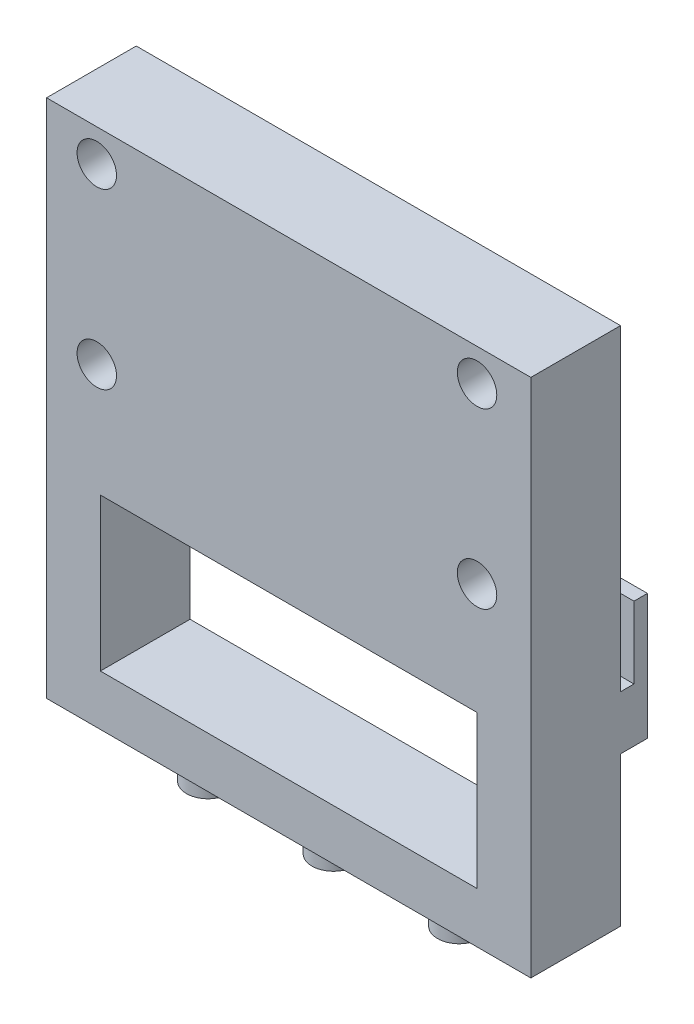
ISO-10303-21;
HEADER;
FILE_DESCRIPTION(('STEP AP214'),'2;1');
FILE_NAME('part.step','',(''),(''),'','','');
FILE_SCHEMA(('AUTOMOTIVE_DESIGN { 1 0 10303 214 1 1 1 1 }'));
ENDSEC;
DATA;
#1=APPLICATION_CONTEXT('core data for automotive mechanical design processes');
#2=APPLICATION_PROTOCOL_DEFINITION('international standard','automotive_design',2000,#1);
#3=PRODUCT_CONTEXT('',#1,'mechanical');
#4=PRODUCT('Part','Part','',(#3));
#5=PRODUCT_RELATED_PRODUCT_CATEGORY('part','',(#4));
#6=PRODUCT_DEFINITION_FORMATION('','',#4);
#7=PRODUCT_DEFINITION_CONTEXT('part definition',#1,'design');
#8=PRODUCT_DEFINITION('design','',#6,#7);
#9=PRODUCT_DEFINITION_SHAPE('','',#8);
#10=(LENGTH_UNIT() NAMED_UNIT(*) SI_UNIT(.MILLI.,.METRE.));
#11=(NAMED_UNIT(*) PLANE_ANGLE_UNIT() SI_UNIT($,.RADIAN.));
#12=(NAMED_UNIT(*) SI_UNIT($,.STERADIAN.) SOLID_ANGLE_UNIT());
#13=UNCERTAINTY_MEASURE_WITH_UNIT(LENGTH_MEASURE(1.E-05),#10,'distance_accuracy_value','');
#14=(GEOMETRIC_REPRESENTATION_CONTEXT(3) GLOBAL_UNCERTAINTY_ASSIGNED_CONTEXT((#13)) GLOBAL_UNIT_ASSIGNED_CONTEXT((#10,
#11,#12)) REPRESENTATION_CONTEXT('',''));
#15=CARTESIAN_POINT('',(0.,0.,0.));
#16=DIRECTION('',(0.,0.,1.));
#17=DIRECTION('',(1.,0.,0.));
#18=AXIS2_PLACEMENT_3D('',#15,#16,#17);
#19=CARTESIAN_POINT('',(-10.5,-3.17907805529329,-1.5));
#20=DIRECTION('',(0.,-1.,0.));
#21=DIRECTION('',(1.,0.,0.));
#22=AXIS2_PLACEMENT_3D('',#19,#20,#21);
#23=PLANE('',#22);
#24=DIRECTION('',(1.,0.,0.));
#25=VECTOR('',#24,1.);
#26=CARTESIAN_POINT('',(-13.5,-3.17907805529329,-0.75));
#27=LINE('',#26,#25);
#28=CARTESIAN_POINT('',(-13.5,-3.17907805529329,-0.75));
#29=VERTEX_POINT('',#28);
#30=CARTESIAN_POINT('',(-10.5,-3.17907805529329,-0.75));
#31=VERTEX_POINT('',#30);
#32=EDGE_CURVE('E443',#29,#31,#27,.T.);
#33=ORIENTED_EDGE('',*,*,#32,.F.);
#34=DIRECTION('',(0.,0.,1.));
#35=VECTOR('',#34,1.);
#36=CARTESIAN_POINT('',(-13.5,-3.17907805529329,-1.5));
#37=LINE('',#36,#35);
#38=CARTESIAN_POINT('',(-13.5,-3.17907805529329,0.));
#39=VERTEX_POINT('',#38);
#40=EDGE_CURVE('E71',#29,#39,#37,.T.);
#41=ORIENTED_EDGE('',*,*,#40,.T.);
#42=DIRECTION('',(1.,0.,0.));
#43=VECTOR('',#42,1.);
#44=CARTESIAN_POINT('',(-10.5,-3.17907805529329,0.));
#45=LINE('',#44,#43);
#46=CARTESIAN_POINT('',(-10.5,-3.17907805529329,0.));
#47=VERTEX_POINT('',#46);
#48=EDGE_CURVE('E256',#39,#47,#45,.T.);
#49=ORIENTED_EDGE('',*,*,#48,.T.);
#50=DIRECTION('',(0.,0.,1.));
#51=VECTOR('',#50,1.);
#52=CARTESIAN_POINT('',(-10.5,-3.17907805529329,-1.5));
#53=LINE('',#52,#51);
#54=EDGE_CURVE('E246',#31,#47,#53,.T.);
#55=ORIENTED_EDGE('',*,*,#54,.F.);
#56=EDGE_LOOP('',(#33,#41,#49,#55));
#57=FACE_BOUND('',#56,.T.);
#58=ADVANCED_FACE('F47',(#57),#23,.F.);
#59=CARTESIAN_POINT('',(13.5,-3.17907805529329,-1.5));
#60=DIRECTION('',(0.,-1.,0.));
#61=DIRECTION('',(0.,0.,-1.));
#62=AXIS2_PLACEMENT_3D('',#59,#60,#61);
#63=PLANE('',#62);
#64=CARTESIAN_POINT('',(10.5,-3.17907805529329,-0.75));
#65=VERTEX_POINT('',#64);
#66=CARTESIAN_POINT('',(13.5,-3.17907805529329,-0.75));
#67=VERTEX_POINT('',#66);
#68=EDGE_CURVE('E446',#65,#67,#27,.T.);
#69=ORIENTED_EDGE('',*,*,#68,.F.);
#70=DIRECTION('',(0.,0.,1.));
#71=VECTOR('',#70,1.);
#72=CARTESIAN_POINT('',(10.5,-3.17907805529329,-1.5));
#73=LINE('',#72,#71);
#74=CARTESIAN_POINT('',(10.5,-3.17907805529329,0.));
#75=VERTEX_POINT('',#74);
#76=EDGE_CURVE('E220',#65,#75,#73,.T.);
#77=ORIENTED_EDGE('',*,*,#76,.T.);
#78=DIRECTION('',(1.,0.,0.));
#79=VECTOR('',#78,1.);
#80=CARTESIAN_POINT('',(13.5,-3.17907805529329,0.));
#81=LINE('',#80,#79);
#82=CARTESIAN_POINT('',(13.5,-3.17907805529329,0.));
#83=VERTEX_POINT('',#82);
#84=EDGE_CURVE('E221',#75,#83,#81,.T.);
#85=ORIENTED_EDGE('',*,*,#84,.T.);
#86=DIRECTION('',(0.,0.,1.));
#87=VECTOR('',#86,1.);
#88=CARTESIAN_POINT('',(13.5,-3.17907805529329,-1.5));
#89=LINE('',#88,#87);
#90=EDGE_CURVE('E240',#67,#83,#89,.T.);
#91=ORIENTED_EDGE('',*,*,#90,.F.);
#92=EDGE_LOOP('',(#69,#77,#85,#91));
#93=FACE_BOUND('',#92,.T.);
#94=ADVANCED_FACE('F455',(#93),#63,.F.);
#95=CARTESIAN_POINT('',(0.,0.,0.));
#96=DIRECTION('',(0.,0.,1.));
#97=DIRECTION('',(1.,0.,0.));
#98=AXIS2_PLACEMENT_3D('',#95,#96,#97);
#99=PLANE('',#98);
#100=CARTESIAN_POINT('',(10.5,12.7,0.));
#101=DIRECTION('',(0.,0.,1.));
#102=DIRECTION('',(1.,0.,0.));
#103=AXIS2_PLACEMENT_3D('',#100,#101,#102);
#104=CIRCLE('',#103,1.1);
#105=CARTESIAN_POINT('',(11.6,12.7,0.));
#106=VERTEX_POINT('',#105);
#107=EDGE_CURVE('E382',#106,#106,#104,.T.);
#108=ORIENTED_EDGE('',*,*,#107,.T.);
#109=EDGE_LOOP('',(#108));
#110=FACE_BOUND('',#109,.T.);
#111=CARTESIAN_POINT('',(-10.7,3.025,0.));
#112=DIRECTION('',(0.,0.,1.));
#113=DIRECTION('',(1.,0.,0.));
#114=AXIS2_PLACEMENT_3D('',#111,#112,#113);
#115=CIRCLE('',#114,1.1);
#116=CARTESIAN_POINT('',(-9.6,3.025,0.));
#117=VERTEX_POINT('',#116);
#118=EDGE_CURVE('E378',#117,#117,#115,.T.);
#119=ORIENTED_EDGE('',*,*,#118,.T.);
#120=EDGE_LOOP('',(#119));
#121=FACE_BOUND('',#120,.T.);
#122=CARTESIAN_POINT('',(10.5,3.025,0.));
#123=DIRECTION('',(0.,0.,1.));
#124=DIRECTION('',(1.,0.,0.));
#125=AXIS2_PLACEMENT_3D('',#122,#123,#124);
#126=CIRCLE('',#125,1.1);
#127=CARTESIAN_POINT('',(11.6,3.025,0.));
#128=VERTEX_POINT('',#127);
#129=EDGE_CURVE('E374',#128,#128,#126,.T.);
#130=ORIENTED_EDGE('',*,*,#129,.T.);
#131=EDGE_LOOP('',(#130));
#132=FACE_BOUND('',#131,.T.);
#133=CARTESIAN_POINT('',(-10.7,12.7,0.));
#134=DIRECTION('',(0.,0.,1.));
#135=DIRECTION('',(1.,0.,0.));
#136=AXIS2_PLACEMENT_3D('',#133,#134,#135);
#137=CIRCLE('',#136,1.1);
#138=CARTESIAN_POINT('',(-9.6,12.7,0.));
#139=VERTEX_POINT('',#138);
#140=EDGE_CURVE('E326',#139,#139,#137,.T.);
#141=ORIENTED_EDGE('',*,*,#140,.T.);
#142=EDGE_LOOP('',(#141));
#143=FACE_BOUND('',#142,.T.);
#144=ORIENTED_EDGE('',*,*,#84,.F.);
#145=DIRECTION('',(-1.,0.,0.));
#146=VECTOR('',#145,1.);
#147=CARTESIAN_POINT('',(0.,-3.1790780552933,0.));
#148=LINE('',#147,#146);
#149=EDGE_CURVE('E370',#75,#47,#148,.T.);
#150=ORIENTED_EDGE('',*,*,#149,.T.);
#151=ORIENTED_EDGE('',*,*,#48,.F.);
#152=DIRECTION('',(0.,-1.,0.));
#153=VECTOR('',#152,1.);
#154=CARTESIAN_POINT('',(-13.5,14.5,0.));
#155=LINE('',#154,#153);
#156=CARTESIAN_POINT('',(-13.5,14.5,0.));
#157=VERTEX_POINT('',#156);
#158=EDGE_CURVE('E350',#157,#39,#155,.T.);
#159=ORIENTED_EDGE('',*,*,#158,.F.);
#160=DIRECTION('',(-1.,0.,0.));
#161=VECTOR('',#160,1.);
#162=CARTESIAN_POINT('',(-13.5,14.5,0.));
#163=LINE('',#162,#161);
#164=CARTESIAN_POINT('',(13.5,14.5,0.));
#165=VERTEX_POINT('',#164);
#166=EDGE_CURVE('E346',#165,#157,#163,.T.);
#167=ORIENTED_EDGE('',*,*,#166,.F.);
#168=DIRECTION('',(0.,1.,0.));
#169=VECTOR('',#168,1.);
#170=CARTESIAN_POINT('',(13.5,14.5,0.));
#171=LINE('',#170,#169);
#172=EDGE_CURVE('E347',#83,#165,#171,.T.);
#173=ORIENTED_EDGE('',*,*,#172,.F.);
#174=EDGE_LOOP('',(#144,#150,#151,#159,#167,#173));
#175=FACE_BOUND('',#174,.T.);
#176=ADVANCED_FACE('F459',(#110,#121,#132,#143,#175),#99,.F.);
#177=DIRECTION('',(-1.,0.,0.));
#178=VECTOR('',#177,1.);
#179=CARTESIAN_POINT('',(13.5,-6.17907805529329,0.));
#180=LINE('',#179,#178);
#181=CARTESIAN_POINT('',(13.5,-6.17907805529329,0.));
#182=VERTEX_POINT('',#181);
#183=CARTESIAN_POINT('',(10.5,-6.17907805529329,0.));
#184=VERTEX_POINT('',#183);
#185=EDGE_CURVE('E213',#182,#184,#180,.T.);
#186=ORIENTED_EDGE('',*,*,#185,.F.);
#187=CARTESIAN_POINT('',(13.5,-14.5,0.));
#188=VERTEX_POINT('',#187);
#189=EDGE_CURVE('E342',#188,#182,#171,.T.);
#190=ORIENTED_EDGE('',*,*,#189,.F.);
#191=DIRECTION('',(1.,0.,0.));
#192=VECTOR('',#191,1.);
#193=CARTESIAN_POINT('',(-13.5,-14.5,0.));
#194=LINE('',#193,#192);
#195=CARTESIAN_POINT('',(-13.5,-14.5,0.));
#196=VERTEX_POINT('',#195);
#197=EDGE_CURVE('E332',#196,#188,#194,.T.);
#198=ORIENTED_EDGE('',*,*,#197,.F.);
#199=CARTESIAN_POINT('',(-13.5,-6.17907805529329,0.));
#200=VERTEX_POINT('',#199);
#201=EDGE_CURVE('E63',#200,#196,#155,.T.);
#202=ORIENTED_EDGE('',*,*,#201,.F.);
#203=DIRECTION('',(-1.,0.,0.));
#204=VECTOR('',#203,1.);
#205=CARTESIAN_POINT('',(-13.5,-6.17907805529329,0.));
#206=LINE('',#205,#204);
#207=CARTESIAN_POINT('',(-10.5,-6.17907805529329,0.));
#208=VERTEX_POINT('',#207);
#209=EDGE_CURVE('E225',#208,#200,#206,.T.);
#210=ORIENTED_EDGE('',*,*,#209,.F.);
#211=DIRECTION('',(0.,-1.,0.));
#212=VECTOR('',#211,1.);
#213=CARTESIAN_POINT('',(-10.5,0.,0.));
#214=LINE('',#213,#212);
#215=CARTESIAN_POINT('',(-10.5,-11.6790780552933,0.));
#216=VERTEX_POINT('',#215);
#217=EDGE_CURVE('E389',#208,#216,#214,.T.);
#218=ORIENTED_EDGE('',*,*,#217,.T.);
#219=DIRECTION('',(1.,0.,0.));
#220=VECTOR('',#219,1.);
#221=CARTESIAN_POINT('',(0.,-11.6790780552933,0.));
#222=LINE('',#221,#220);
#223=CARTESIAN_POINT('',(10.5,-11.6790780552933,0.));
#224=VERTEX_POINT('',#223);
#225=EDGE_CURVE('E392',#216,#224,#222,.T.);
#226=ORIENTED_EDGE('',*,*,#225,.T.);
#227=DIRECTION('',(0.,1.,0.));
#228=VECTOR('',#227,1.);
#229=CARTESIAN_POINT('',(10.5,0.,0.));
#230=LINE('',#229,#228);
#231=EDGE_CURVE('E396',#224,#184,#230,.T.);
#232=ORIENTED_EDGE('',*,*,#231,.T.);
#233=EDGE_LOOP('',(#186,#190,#198,#202,#210,#218,#226,#232));
#234=FACE_BOUND('',#233,.T.);
#235=ADVANCED_FACE('F424',(#234),#99,.F.);
#236=CARTESIAN_POINT('',(13.5,14.5,5.));
#237=DIRECTION('',(-1.,0.,0.));
#238=DIRECTION('',(0.,-1.,0.));
#239=AXIS2_PLACEMENT_3D('',#236,#237,#238);
#240=PLANE('',#239);
#241=ORIENTED_EDGE('',*,*,#189,.T.);
#242=DIRECTION('',(0.,0.,1.));
#243=VECTOR('',#242,1.);
#244=CARTESIAN_POINT('',(13.5,-6.17907805529329,-1.5));
#245=LINE('',#244,#243);
#246=CARTESIAN_POINT('',(13.5,-6.17907805529329,-1.5));
#247=VERTEX_POINT('',#246);
#248=EDGE_CURVE('E236',#247,#182,#245,.T.);
#249=ORIENTED_EDGE('',*,*,#248,.F.);
#250=DIRECTION('',(0.,-1.,0.));
#251=VECTOR('',#250,1.);
#252=CARTESIAN_POINT('',(13.5,-3.17907805529329,-1.5));
#253=LINE('',#252,#251);
#254=CARTESIAN_POINT('',(13.5,0.820921944706707,-1.5));
#255=VERTEX_POINT('',#254);
#256=EDGE_CURVE('E209',#255,#247,#253,.T.);
#257=ORIENTED_EDGE('',*,*,#256,.F.);
#258=DIRECTION('',(0.,0.,-1.));
#259=VECTOR('',#258,1.);
#260=CARTESIAN_POINT('',(13.5,0.820921944706707,-1.5));
#261=LINE('',#260,#259);
#262=CARTESIAN_POINT('',(13.5,0.820921944706707,-0.75));
#263=VERTEX_POINT('',#262);
#264=EDGE_CURVE('E186',#263,#255,#261,.T.);
#265=ORIENTED_EDGE('',*,*,#264,.F.);
#266=DIRECTION('',(0.,-1.,0.));
#267=VECTOR('',#266,1.);
#268=CARTESIAN_POINT('',(13.5,0.820921944706707,-0.75));
#269=LINE('',#268,#267);
#270=EDGE_CURVE('E181',#263,#67,#269,.T.);
#271=ORIENTED_EDGE('',*,*,#270,.T.);
#272=ORIENTED_EDGE('',*,*,#90,.T.);
#273=ORIENTED_EDGE('',*,*,#172,.T.);
#274=DIRECTION('',(0.,0.,-1.));
#275=VECTOR('',#274,1.);
#276=CARTESIAN_POINT('',(13.5,14.5,5.));
#277=LINE('',#276,#275);
#278=CARTESIAN_POINT('',(13.5,14.5,5.));
#279=VERTEX_POINT('',#278);
#280=EDGE_CURVE('E366',#279,#165,#277,.T.);
#281=ORIENTED_EDGE('',*,*,#280,.F.);
#282=DIRECTION('',(0.,1.,0.));
#283=VECTOR('',#282,1.);
#284=CARTESIAN_POINT('',(13.5,14.5,5.));
#285=LINE('',#284,#283);
#286=CARTESIAN_POINT('',(13.5,-14.5,5.));
#287=VERTEX_POINT('',#286);
#288=EDGE_CURVE('E327',#287,#279,#285,.T.);
#289=ORIENTED_EDGE('',*,*,#288,.F.);
#290=DIRECTION('',(0.,0.,-1.));
#291=VECTOR('',#290,1.);
#292=CARTESIAN_POINT('',(13.5,-14.5,5.));
#293=LINE('',#292,#291);
#294=EDGE_CURVE('E341',#287,#188,#293,.T.);
#295=ORIENTED_EDGE('',*,*,#294,.T.);
#296=EDGE_LOOP('',(#241,#249,#257,#265,#271,#272,#273,#281,#289,#295));
#297=FACE_BOUND('',#296,.T.);
#298=ADVANCED_FACE('F49',(#297),#240,.F.);
#299=CARTESIAN_POINT('',(-13.5,14.5,5.));
#300=DIRECTION('',(0.,-1.,0.));
#301=DIRECTION('',(0.,0.,-1.));
#302=AXIS2_PLACEMENT_3D('',#299,#300,#301);
#303=PLANE('',#302);
#304=ORIENTED_EDGE('',*,*,#166,.T.);
#305=DIRECTION('',(0.,0.,-1.));
#306=VECTOR('',#305,1.);
#307=CARTESIAN_POINT('',(-13.5,14.5,5.));
#308=LINE('',#307,#306);
#309=CARTESIAN_POINT('',(-13.5,14.5,5.));
#310=VERTEX_POINT('',#309);
#311=EDGE_CURVE('E362',#310,#157,#308,.T.);
#312=ORIENTED_EDGE('',*,*,#311,.F.);
#313=DIRECTION('',(-1.,0.,0.));
#314=VECTOR('',#313,1.);
#315=CARTESIAN_POINT('',(-13.5,14.5,5.));
#316=LINE('',#315,#314);
#317=EDGE_CURVE('E331',#279,#310,#316,.T.);
#318=ORIENTED_EDGE('',*,*,#317,.F.);
#319=ORIENTED_EDGE('',*,*,#280,.T.);
#320=EDGE_LOOP('',(#304,#312,#318,#319));
#321=FACE_BOUND('',#320,.T.);
#322=ADVANCED_FACE('F660',(#321),#303,.F.);
#323=CARTESIAN_POINT('',(-13.5,14.5,5.));
#324=DIRECTION('',(1.,0.,0.));
#325=DIRECTION('',(0.,1.,0.));
#326=AXIS2_PLACEMENT_3D('',#323,#324,#325);
#327=PLANE('',#326);
#328=ORIENTED_EDGE('',*,*,#158,.T.);
#329=ORIENTED_EDGE('',*,*,#40,.F.);
#330=DIRECTION('',(0.,-1.,0.));
#331=VECTOR('',#330,1.);
#332=CARTESIAN_POINT('',(-13.5,0.820921944706707,-0.75));
#333=LINE('',#332,#331);
#334=CARTESIAN_POINT('',(-13.5,0.820921944706707,-0.75));
#335=VERTEX_POINT('',#334);
#336=EDGE_CURVE('E179',#335,#29,#333,.T.);
#337=ORIENTED_EDGE('',*,*,#336,.F.);
#338=DIRECTION('',(0.,0.,1.));
#339=VECTOR('',#338,1.);
#340=CARTESIAN_POINT('',(-13.5,0.820921944706707,-1.5));
#341=LINE('',#340,#339);
#342=CARTESIAN_POINT('',(-13.5,0.820921944706707,-1.5));
#343=VERTEX_POINT('',#342);
#344=EDGE_CURVE('E187',#343,#335,#341,.T.);
#345=ORIENTED_EDGE('',*,*,#344,.F.);
#346=DIRECTION('',(0.,1.,0.));
#347=VECTOR('',#346,1.);
#348=CARTESIAN_POINT('',(-13.5,-3.17907805529329,-1.5));
#349=LINE('',#348,#347);
#350=CARTESIAN_POINT('',(-13.5,-6.17907805529329,-1.5));
#351=VERTEX_POINT('',#350);
#352=EDGE_CURVE('E265',#351,#343,#349,.T.);
#353=ORIENTED_EDGE('',*,*,#352,.F.);
#354=DIRECTION('',(0.,0.,1.));
#355=VECTOR('',#354,1.);
#356=CARTESIAN_POINT('',(-13.5,-6.17907805529329,-1.5));
#357=LINE('',#356,#355);
#358=EDGE_CURVE('E201',#351,#200,#357,.T.);
#359=ORIENTED_EDGE('',*,*,#358,.T.);
#360=ORIENTED_EDGE('',*,*,#201,.T.);
#361=DIRECTION('',(0.,0.,-1.));
#362=VECTOR('',#361,1.);
#363=CARTESIAN_POINT('',(-13.5,-14.5,5.));
#364=LINE('',#363,#362);
#365=CARTESIAN_POINT('',(-13.5,-14.5,5.));
#366=VERTEX_POINT('',#365);
#367=EDGE_CURVE('E358',#366,#196,#364,.T.);
#368=ORIENTED_EDGE('',*,*,#367,.F.);
#369=DIRECTION('',(0.,-1.,0.));
#370=VECTOR('',#369,1.);
#371=CARTESIAN_POINT('',(-13.5,14.5,5.));
#372=LINE('',#371,#370);
#373=EDGE_CURVE('E335',#310,#366,#372,.T.);
#374=ORIENTED_EDGE('',*,*,#373,.F.);
#375=ORIENTED_EDGE('',*,*,#311,.T.);
#376=EDGE_LOOP('',(#328,#329,#337,#345,#353,#359,#360,#368,#374,#375));
#377=FACE_BOUND('',#376,.T.);
#378=ADVANCED_FACE('F199',(#377),#327,.F.);
#379=CARTESIAN_POINT('',(-13.5,-14.5,5.));
#380=DIRECTION('',(0.,1.,0.));
#381=DIRECTION('',(0.,0.,1.));
#382=AXIS2_PLACEMENT_3D('',#379,#380,#381);
#383=PLANE('',#382);
#384=CARTESIAN_POINT('',(-6.99999999999999,-14.5,2.5));
#385=DIRECTION('',(0.,1.,0.));
#386=DIRECTION('',(0.,0.,1.));
#387=AXIS2_PLACEMENT_3D('',#384,#385,#386);
#388=CIRCLE('',#387,1.2);
#389=CARTESIAN_POINT('',(-6.99999999999999,-14.5,3.69999999999999));
#390=VERTEX_POINT('',#389);
#391=EDGE_CURVE('E11',#390,#390,#388,.F.);
#392=ORIENTED_EDGE('',*,*,#391,.F.);
#393=EDGE_LOOP('',(#392));
#394=FACE_BOUND('',#393,.T.);
#395=CARTESIAN_POINT('',(0.,-14.5,2.5));
#396=DIRECTION('',(0.,1.,0.));
#397=DIRECTION('',(0.,0.,1.));
#398=AXIS2_PLACEMENT_3D('',#395,#396,#397);
#399=CIRCLE('',#398,1.2);
#400=CARTESIAN_POINT('',(0.,-14.5,3.69999999999999));
#401=VERTEX_POINT('',#400);
#402=EDGE_CURVE('E56',#401,#401,#399,.F.);
#403=ORIENTED_EDGE('',*,*,#402,.F.);
#404=EDGE_LOOP('',(#403));
#405=FACE_BOUND('',#404,.T.);
#406=CARTESIAN_POINT('',(7.00000000000001,-14.5,2.5));
#407=DIRECTION('',(0.,1.,0.));
#408=DIRECTION('',(0.,0.,1.));
#409=AXIS2_PLACEMENT_3D('',#406,#407,#408);
#410=CIRCLE('',#409,1.2);
#411=CARTESIAN_POINT('',(7.00000000000001,-14.5,3.7));
#412=VERTEX_POINT('',#411);
#413=EDGE_CURVE('E399',#412,#412,#410,.F.);
#414=ORIENTED_EDGE('',*,*,#413,.F.);
#415=EDGE_LOOP('',(#414));
#416=FACE_BOUND('',#415,.T.);
#417=ORIENTED_EDGE('',*,*,#197,.T.);
#418=ORIENTED_EDGE('',*,*,#294,.F.);
#419=DIRECTION('',(1.,0.,0.));
#420=VECTOR('',#419,1.);
#421=CARTESIAN_POINT('',(-13.5,-14.5,5.));
#422=LINE('',#421,#420);
#423=EDGE_CURVE('E338',#366,#287,#422,.T.);
#424=ORIENTED_EDGE('',*,*,#423,.F.);
#425=ORIENTED_EDGE('',*,*,#367,.T.);
#426=EDGE_LOOP('',(#417,#418,#424,#425));
#427=FACE_BOUND('',#426,.T.);
#428=ADVANCED_FACE('F408',(#394,#405,#416,#427),#383,.F.);
#429=CARTESIAN_POINT('',(0.,0.,5.));
#430=DIRECTION('',(0.,0.,1.));
#431=DIRECTION('',(1.,0.,0.));
#432=AXIS2_PLACEMENT_3D('',#429,#430,#431);
#433=PLANE('',#432);
#434=DIRECTION('',(0.,1.,0.));
#435=VECTOR('',#434,1.);
#436=CARTESIAN_POINT('',(10.5,-3.17907805529329,5.));
#437=LINE('',#436,#435);
#438=CARTESIAN_POINT('',(10.5,-11.6790780552933,5.));
#439=VERTEX_POINT('',#438);
#440=CARTESIAN_POINT('',(10.5,-3.17907805529329,5.));
#441=VERTEX_POINT('',#440);
#442=EDGE_CURVE('E275',#439,#441,#437,.T.);
#443=ORIENTED_EDGE('',*,*,#442,.F.);
#444=DIRECTION('',(1.,0.,0.));
#445=VECTOR('',#444,1.);
#446=CARTESIAN_POINT('',(-10.5,-11.6790780552933,5.));
#447=LINE('',#446,#445);
#448=CARTESIAN_POINT('',(-10.5,-11.6790780552933,5.));
#449=VERTEX_POINT('',#448);
#450=EDGE_CURVE('E293',#449,#439,#447,.T.);
#451=ORIENTED_EDGE('',*,*,#450,.F.);
#452=DIRECTION('',(0.,-1.,0.));
#453=VECTOR('',#452,1.);
#454=CARTESIAN_POINT('',(-10.5,-3.1790780552933,5.));
#455=LINE('',#454,#453);
#456=CARTESIAN_POINT('',(-10.5,-3.1790780552933,5.));
#457=VERTEX_POINT('',#456);
#458=EDGE_CURVE('E289',#457,#449,#455,.T.);
#459=ORIENTED_EDGE('',*,*,#458,.F.);
#460=DIRECTION('',(-1.,0.,0.));
#461=VECTOR('',#460,1.);
#462=CARTESIAN_POINT('',(-10.5,-3.1790780552933,5.));
#463=LINE('',#462,#461);
#464=EDGE_CURVE('E285',#441,#457,#463,.T.);
#465=ORIENTED_EDGE('',*,*,#464,.F.);
#466=EDGE_LOOP('',(#443,#451,#459,#465));
#467=FACE_BOUND('',#466,.T.);
#468=CARTESIAN_POINT('',(10.5,12.7,5.));
#469=DIRECTION('',(0.,0.,1.));
#470=DIRECTION('',(-1.,0.,0.));
#471=AXIS2_PLACEMENT_3D('',#468,#469,#470);
#472=CIRCLE('',#471,1.1);
#473=CARTESIAN_POINT('',(9.4,12.7,5.));
#474=VERTEX_POINT('',#473);
#475=EDGE_CURVE('E315',#474,#474,#472,.T.);
#476=ORIENTED_EDGE('',*,*,#475,.F.);
#477=EDGE_LOOP('',(#476));
#478=FACE_BOUND('',#477,.T.);
#479=CARTESIAN_POINT('',(-10.7,3.025,5.));
#480=DIRECTION('',(0.,0.,1.));
#481=DIRECTION('',(1.,0.,0.));
#482=AXIS2_PLACEMENT_3D('',#479,#480,#481);
#483=CIRCLE('',#482,1.1);
#484=CARTESIAN_POINT('',(-9.6,3.025,5.));
#485=VERTEX_POINT('',#484);
#486=EDGE_CURVE('E314',#485,#485,#483,.T.);
#487=ORIENTED_EDGE('',*,*,#486,.F.);
#488=EDGE_LOOP('',(#487));
#489=FACE_BOUND('',#488,.T.);
#490=CARTESIAN_POINT('',(10.5,3.025,5.));
#491=DIRECTION('',(0.,0.,1.));
#492=DIRECTION('',(-1.,0.,0.));
#493=AXIS2_PLACEMENT_3D('',#490,#491,#492);
#494=CIRCLE('',#493,1.1);
#495=CARTESIAN_POINT('',(9.4,3.025,5.));
#496=VERTEX_POINT('',#495);
#497=EDGE_CURVE('E301',#496,#496,#494,.T.);
#498=ORIENTED_EDGE('',*,*,#497,.F.);
#499=EDGE_LOOP('',(#498));
#500=FACE_BOUND('',#499,.T.);
#501=CARTESIAN_POINT('',(-10.7,12.7,5.));
#502=DIRECTION('',(0.,0.,1.));
#503=DIRECTION('',(1.,0.,0.));
#504=AXIS2_PLACEMENT_3D('',#501,#502,#503);
#505=CIRCLE('',#504,1.1);
#506=CARTESIAN_POINT('',(-9.6,12.7,5.));
#507=VERTEX_POINT('',#506);
#508=EDGE_CURVE('E319',#507,#507,#505,.T.);
#509=ORIENTED_EDGE('',*,*,#508,.F.);
#510=EDGE_LOOP('',(#509));
#511=FACE_BOUND('',#510,.T.);
#512=ORIENTED_EDGE('',*,*,#288,.T.);
#513=ORIENTED_EDGE('',*,*,#317,.T.);
#514=ORIENTED_EDGE('',*,*,#373,.T.);
#515=ORIENTED_EDGE('',*,*,#423,.T.);
#516=EDGE_LOOP('',(#512,#513,#514,#515));
#517=FACE_BOUND('',#516,.T.);
#518=ADVANCED_FACE('F411',(#467,#478,#489,#500,#511,#517),#433,.T.);
#519=CARTESIAN_POINT('',(-10.7,12.7,-5.));
#520=DIRECTION('',(0.,0.,1.));
#521=DIRECTION('',(1.,0.,0.));
#522=AXIS2_PLACEMENT_3D('',#519,#520,#521);
#523=CYLINDRICAL_SURFACE('',#522,1.1);
#524=ORIENTED_EDGE('',*,*,#508,.T.);
#525=EDGE_LOOP('',(#524));
#526=FACE_BOUND('',#525,.T.);
#527=ORIENTED_EDGE('',*,*,#140,.F.);
#528=EDGE_LOOP('',(#527));
#529=FACE_BOUND('',#528,.T.);
#530=ADVANCED_FACE('F697',(#526,#529),#523,.F.);
#531=CARTESIAN_POINT('',(10.5,3.025,-5.));
#532=DIRECTION('',(0.,0.,1.));
#533=DIRECTION('',(1.,0.,0.));
#534=AXIS2_PLACEMENT_3D('',#531,#532,#533);
#535=CYLINDRICAL_SURFACE('',#534,1.1);
#536=ORIENTED_EDGE('',*,*,#497,.T.);
#537=EDGE_LOOP('',(#536));
#538=FACE_BOUND('',#537,.T.);
#539=ORIENTED_EDGE('',*,*,#129,.F.);
#540=EDGE_LOOP('',(#539));
#541=FACE_BOUND('',#540,.T.);
#542=ADVANCED_FACE('F707',(#538,#541),#535,.F.);
#543=CARTESIAN_POINT('',(-10.7,3.025,-5.));
#544=DIRECTION('',(0.,0.,1.));
#545=DIRECTION('',(1.,0.,0.));
#546=AXIS2_PLACEMENT_3D('',#543,#544,#545);
#547=CYLINDRICAL_SURFACE('',#546,1.1);
#548=ORIENTED_EDGE('',*,*,#486,.T.);
#549=EDGE_LOOP('',(#548));
#550=FACE_BOUND('',#549,.T.);
#551=ORIENTED_EDGE('',*,*,#118,.F.);
#552=EDGE_LOOP('',(#551));
#553=FACE_BOUND('',#552,.T.);
#554=ADVANCED_FACE('F717',(#550,#553),#547,.F.);
#555=CARTESIAN_POINT('',(10.5,12.7,-5.));
#556=DIRECTION('',(0.,0.,1.));
#557=DIRECTION('',(1.,0.,0.));
#558=AXIS2_PLACEMENT_3D('',#555,#556,#557);
#559=CYLINDRICAL_SURFACE('',#558,1.1);
#560=ORIENTED_EDGE('',*,*,#475,.T.);
#561=EDGE_LOOP('',(#560));
#562=FACE_BOUND('',#561,.T.);
#563=ORIENTED_EDGE('',*,*,#107,.F.);
#564=EDGE_LOOP('',(#563));
#565=FACE_BOUND('',#564,.T.);
#566=ADVANCED_FACE('F498',(#562,#565),#559,.F.);
#567=CARTESIAN_POINT('',(10.5,-3.17907805529329,-5.));
#568=DIRECTION('',(1.,0.,0.));
#569=DIRECTION('',(0.,1.,0.));
#570=AXIS2_PLACEMENT_3D('',#567,#568,#569);
#571=PLANE('',#570);
#572=DIRECTION('',(0.,0.,1.));
#573=VECTOR('',#572,1.);
#574=CARTESIAN_POINT('',(10.5,-11.6790780552933,-5.));
#575=LINE('',#574,#573);
#576=EDGE_CURVE('E298',#224,#439,#575,.T.);
#577=ORIENTED_EDGE('',*,*,#576,.T.);
#578=ORIENTED_EDGE('',*,*,#442,.T.);
#579=DIRECTION('',(0.,0.,1.));
#580=VECTOR('',#579,1.);
#581=CARTESIAN_POINT('',(10.5,-3.17907805529329,-5.));
#582=LINE('',#581,#580);
#583=EDGE_CURVE('E297',#75,#441,#582,.T.);
#584=ORIENTED_EDGE('',*,*,#583,.F.);
#585=ORIENTED_EDGE('',*,*,#76,.F.);
#586=CARTESIAN_POINT('',(10.5,-3.17907805529329,-1.5));
#587=VERTEX_POINT('',#586);
#588=EDGE_CURVE('E229',#587,#65,#73,.T.);
#589=ORIENTED_EDGE('',*,*,#588,.F.);
#590=DIRECTION('',(0.,1.,0.));
#591=VECTOR('',#590,1.);
#592=CARTESIAN_POINT('',(10.5,-6.17907805529329,-1.5));
#593=LINE('',#592,#591);
#594=CARTESIAN_POINT('',(10.5,-6.17907805529329,-1.5));
#595=VERTEX_POINT('',#594);
#596=EDGE_CURVE('E216',#595,#587,#593,.T.);
#597=ORIENTED_EDGE('',*,*,#596,.F.);
#598=DIRECTION('',(0.,0.,1.));
#599=VECTOR('',#598,1.);
#600=CARTESIAN_POINT('',(10.5,-6.17907805529329,-1.5));
#601=LINE('',#600,#599);
#602=EDGE_CURVE('E232',#595,#184,#601,.T.);
#603=ORIENTED_EDGE('',*,*,#602,.T.);
#604=ORIENTED_EDGE('',*,*,#231,.F.);
#605=EDGE_LOOP('',(#577,#578,#584,#585,#589,#597,#603,#604));
#606=FACE_BOUND('',#605,.T.);
#607=ADVANCED_FACE('F431',(#606),#571,.F.);
#608=CARTESIAN_POINT('',(-10.5,-11.6790780552933,-5.));
#609=DIRECTION('',(0.,-1.,0.));
#610=DIRECTION('',(1.,0.,0.));
#611=AXIS2_PLACEMENT_3D('',#608,#609,#610);
#612=PLANE('',#611);
#613=DIRECTION('',(0.,0.,1.));
#614=VECTOR('',#613,1.);
#615=CARTESIAN_POINT('',(-10.5,-11.6790780552933,-5.));
#616=LINE('',#615,#614);
#617=EDGE_CURVE('E302',#216,#449,#616,.T.);
#618=ORIENTED_EDGE('',*,*,#617,.T.);
#619=ORIENTED_EDGE('',*,*,#450,.T.);
#620=ORIENTED_EDGE('',*,*,#576,.F.);
#621=ORIENTED_EDGE('',*,*,#225,.F.);
#622=EDGE_LOOP('',(#618,#619,#620,#621));
#623=FACE_BOUND('',#622,.T.);
#624=ADVANCED_FACE('F489',(#623),#612,.F.);
#625=CARTESIAN_POINT('',(-10.5,-3.1790780552933,-5.));
#626=DIRECTION('',(-1.,0.,0.));
#627=DIRECTION('',(0.,0.,1.));
#628=AXIS2_PLACEMENT_3D('',#625,#626,#627);
#629=PLANE('',#628);
#630=DIRECTION('',(0.,0.,1.));
#631=VECTOR('',#630,1.);
#632=CARTESIAN_POINT('',(-10.5,-3.1790780552933,-5.));
#633=LINE('',#632,#631);
#634=EDGE_CURVE('E305',#47,#457,#633,.T.);
#635=ORIENTED_EDGE('',*,*,#634,.T.);
#636=ORIENTED_EDGE('',*,*,#458,.T.);
#637=ORIENTED_EDGE('',*,*,#617,.F.);
#638=ORIENTED_EDGE('',*,*,#217,.F.);
#639=DIRECTION('',(0.,0.,1.));
#640=VECTOR('',#639,1.);
#641=CARTESIAN_POINT('',(-10.5,-6.17907805529329,-1.5));
#642=LINE('',#641,#640);
#643=CARTESIAN_POINT('',(-10.5,-6.17907805529329,-1.5));
#644=VERTEX_POINT('',#643);
#645=EDGE_CURVE('E251',#644,#208,#642,.T.);
#646=ORIENTED_EDGE('',*,*,#645,.F.);
#647=DIRECTION('',(0.,-1.,0.));
#648=VECTOR('',#647,1.);
#649=CARTESIAN_POINT('',(-10.5,-6.17907805529329,-1.5));
#650=LINE('',#649,#648);
#651=CARTESIAN_POINT('',(-10.5,-3.17907805529329,-1.5));
#652=VERTEX_POINT('',#651);
#653=EDGE_CURVE('E255',#652,#644,#650,.T.);
#654=ORIENTED_EDGE('',*,*,#653,.F.);
#655=EDGE_CURVE('E247',#652,#31,#53,.T.);
#656=ORIENTED_EDGE('',*,*,#655,.T.);
#657=ORIENTED_EDGE('',*,*,#54,.T.);
#658=EDGE_LOOP('',(#635,#636,#637,#638,#646,#654,#656,#657));
#659=FACE_BOUND('',#658,.T.);
#660=ADVANCED_FACE('F473',(#659),#629,.F.);
#661=CARTESIAN_POINT('',(-10.5,-3.1790780552933,-5.));
#662=DIRECTION('',(0.,1.,0.));
#663=DIRECTION('',(-1.,0.,0.));
#664=AXIS2_PLACEMENT_3D('',#661,#662,#663);
#665=PLANE('',#664);
#666=ORIENTED_EDGE('',*,*,#583,.T.);
#667=ORIENTED_EDGE('',*,*,#464,.T.);
#668=ORIENTED_EDGE('',*,*,#634,.F.);
#669=ORIENTED_EDGE('',*,*,#149,.F.);
#670=EDGE_LOOP('',(#666,#667,#668,#669));
#671=FACE_BOUND('',#670,.T.);
#672=ADVANCED_FACE('F464',(#671),#665,.F.);
#673=CARTESIAN_POINT('',(7.00000000000001,-16.5,2.5));
#674=DIRECTION('',(0.,1.,0.));
#675=DIRECTION('',(0.,0.,1.));
#676=AXIS2_PLACEMENT_3D('',#673,#674,#675);
#677=CYLINDRICAL_SURFACE('',#676,1.2);
#678=CARTESIAN_POINT('',(7.00000000000001,-16.5,2.5));
#679=DIRECTION('',(0.,-1.,0.));
#680=DIRECTION('',(0.,0.,-1.));
#681=AXIS2_PLACEMENT_3D('',#678,#679,#680);
#682=CIRCLE('',#681,1.2);
#683=CARTESIAN_POINT('',(7.00000000000001,-16.5,1.29999999999999));
#684=VERTEX_POINT('',#683);
#685=EDGE_CURVE('E242',#684,#684,#682,.T.);
#686=ORIENTED_EDGE('',*,*,#685,.F.);
#687=EDGE_LOOP('',(#686));
#688=FACE_BOUND('',#687,.T.);
#689=ORIENTED_EDGE('',*,*,#413,.T.);
#690=EDGE_LOOP('',(#689));
#691=FACE_BOUND('',#690,.T.);
#692=ADVANCED_FACE('F526',(#688,#691),#677,.T.);
#693=CARTESIAN_POINT('',(7.00000000000001,-16.5,2.5));
#694=DIRECTION('',(0.,-1.,0.));
#695=DIRECTION('',(0.,0.,-1.));
#696=AXIS2_PLACEMENT_3D('',#693,#694,#695);
#697=PLANE('',#696);
#698=ORIENTED_EDGE('',*,*,#685,.T.);
#699=EDGE_LOOP('',(#698));
#700=FACE_BOUND('',#699,.T.);
#701=ADVANCED_FACE('F521',(#700),#697,.T.);
#702=CARTESIAN_POINT('',(0.,-16.5,2.5));
#703=DIRECTION('',(0.,1.,0.));
#704=DIRECTION('',(0.,0.,1.));
#705=AXIS2_PLACEMENT_3D('',#702,#703,#704);
#706=CYLINDRICAL_SURFACE('',#705,1.2);
#707=CARTESIAN_POINT('',(0.,-16.5,2.5));
#708=DIRECTION('',(0.,-1.,0.));
#709=DIRECTION('',(0.,0.,-1.));
#710=AXIS2_PLACEMENT_3D('',#707,#708,#709);
#711=CIRCLE('',#710,1.2);
#712=CARTESIAN_POINT('',(0.,-16.5,1.3));
#713=VERTEX_POINT('',#712);
#714=EDGE_CURVE('E276',#713,#713,#711,.T.);
#715=ORIENTED_EDGE('',*,*,#714,.F.);
#716=EDGE_LOOP('',(#715));
#717=FACE_BOUND('',#716,.T.);
#718=ORIENTED_EDGE('',*,*,#402,.T.);
#719=EDGE_LOOP('',(#718));
#720=FACE_BOUND('',#719,.T.);
#721=ADVANCED_FACE('F406',(#717,#720),#706,.T.);
#722=CARTESIAN_POINT('',(0.,-16.5,2.5));
#723=DIRECTION('',(0.,-1.,0.));
#724=DIRECTION('',(0.,0.,-1.));
#725=AXIS2_PLACEMENT_3D('',#722,#723,#724);
#726=PLANE('',#725);
#727=ORIENTED_EDGE('',*,*,#714,.T.);
#728=EDGE_LOOP('',(#727));
#729=FACE_BOUND('',#728,.T.);
#730=ADVANCED_FACE('F517',(#729),#726,.T.);
#731=CARTESIAN_POINT('',(-6.99999999999999,-16.5,2.5));
#732=DIRECTION('',(0.,1.,0.));
#733=DIRECTION('',(0.,0.,1.));
#734=AXIS2_PLACEMENT_3D('',#731,#732,#733);
#735=CYLINDRICAL_SURFACE('',#734,1.2);
#736=CARTESIAN_POINT('',(-6.99999999999999,-16.5,2.5));
#737=DIRECTION('',(0.,-1.,0.));
#738=DIRECTION('',(0.,0.,-1.));
#739=AXIS2_PLACEMENT_3D('',#736,#737,#738);
#740=CIRCLE('',#739,1.2);
#741=CARTESIAN_POINT('',(-6.99999999999999,-16.5,1.3));
#742=VERTEX_POINT('',#741);
#743=EDGE_CURVE('E271',#742,#742,#740,.T.);
#744=ORIENTED_EDGE('',*,*,#743,.F.);
#745=EDGE_LOOP('',(#744));
#746=FACE_BOUND('',#745,.T.);
#747=ORIENTED_EDGE('',*,*,#391,.T.);
#748=EDGE_LOOP('',(#747));
#749=FACE_BOUND('',#748,.T.);
#750=ADVANCED_FACE('F513',(#746,#749),#735,.T.);
#751=CARTESIAN_POINT('',(-6.99999999999999,-16.5,2.5));
#752=DIRECTION('',(0.,-1.,0.));
#753=DIRECTION('',(0.,0.,-1.));
#754=AXIS2_PLACEMENT_3D('',#751,#752,#753);
#755=PLANE('',#754);
#756=ORIENTED_EDGE('',*,*,#743,.T.);
#757=EDGE_LOOP('',(#756));
#758=FACE_BOUND('',#757,.T.);
#759=ADVANCED_FACE('F510',(#758),#755,.T.);
#760=CARTESIAN_POINT('',(-13.5,-6.17907805529329,-1.5));
#761=DIRECTION('',(0.,1.,0.));
#762=DIRECTION('',(-1.,0.,0.));
#763=AXIS2_PLACEMENT_3D('',#760,#761,#762);
#764=PLANE('',#763);
#765=ORIENTED_EDGE('',*,*,#209,.T.);
#766=ORIENTED_EDGE('',*,*,#358,.F.);
#767=DIRECTION('',(-1.,0.,0.));
#768=VECTOR('',#767,1.);
#769=CARTESIAN_POINT('',(-13.5,-6.17907805529329,-1.5));
#770=LINE('',#769,#768);
#771=EDGE_CURVE('E259',#644,#351,#770,.T.);
#772=ORIENTED_EDGE('',*,*,#771,.F.);
#773=ORIENTED_EDGE('',*,*,#645,.T.);
#774=EDGE_LOOP('',(#765,#766,#772,#773));
#775=FACE_BOUND('',#774,.T.);
#776=ADVANCED_FACE('F485',(#775),#764,.F.);
#777=CARTESIAN_POINT('',(13.5,-6.17907805529329,-1.5));
#778=DIRECTION('',(0.,1.,0.));
#779=DIRECTION('',(0.,0.,1.));
#780=AXIS2_PLACEMENT_3D('',#777,#778,#779);
#781=PLANE('',#780);
#782=ORIENTED_EDGE('',*,*,#185,.T.);
#783=ORIENTED_EDGE('',*,*,#602,.F.);
#784=DIRECTION('',(-1.,0.,0.));
#785=VECTOR('',#784,1.);
#786=CARTESIAN_POINT('',(13.5,-6.17907805529329,-1.5));
#787=LINE('',#786,#785);
#788=EDGE_CURVE('E212',#247,#595,#787,.T.);
#789=ORIENTED_EDGE('',*,*,#788,.F.);
#790=ORIENTED_EDGE('',*,*,#248,.T.);
#791=EDGE_LOOP('',(#782,#783,#789,#790));
#792=FACE_BOUND('',#791,.T.);
#793=ADVANCED_FACE('F427',(#792),#781,.F.);
#794=CARTESIAN_POINT('',(0.,0.,-1.5));
#795=DIRECTION('',(0.,0.,-1.));
#796=DIRECTION('',(-1.,0.,0.));
#797=AXIS2_PLACEMENT_3D('',#794,#795,#796);
#798=PLANE('',#797);
#799=ORIENTED_EDGE('',*,*,#596,.T.);
#800=DIRECTION('',(-1.,0.,0.));
#801=VECTOR('',#800,1.);
#802=CARTESIAN_POINT('',(-13.5,-3.17907805529329,-1.5));
#803=LINE('',#802,#801);
#804=EDGE_CURVE('E196',#587,#652,#803,.T.);
#805=ORIENTED_EDGE('',*,*,#804,.T.);
#806=ORIENTED_EDGE('',*,*,#653,.T.);
#807=ORIENTED_EDGE('',*,*,#771,.T.);
#808=ORIENTED_EDGE('',*,*,#352,.T.);
#809=DIRECTION('',(-1.,0.,0.));
#810=VECTOR('',#809,1.);
#811=CARTESIAN_POINT('',(-13.5,0.820921944706707,-1.5));
#812=LINE('',#811,#810);
#813=EDGE_CURVE('E193',#255,#343,#812,.T.);
#814=ORIENTED_EDGE('',*,*,#813,.F.);
#815=ORIENTED_EDGE('',*,*,#256,.T.);
#816=ORIENTED_EDGE('',*,*,#788,.T.);
#817=EDGE_LOOP('',(#799,#805,#806,#807,#808,#814,#815,#816));
#818=FACE_BOUND('',#817,.T.);
#819=ADVANCED_FACE('F436',(#818),#798,.T.);
#820=CARTESIAN_POINT('',(0.,-3.17907805529329,0.));
#821=DIRECTION('',(0.,1.,0.));
#822=DIRECTION('',(0.,0.,1.));
#823=AXIS2_PLACEMENT_3D('',#820,#821,#822);
#824=PLANE('',#823);
#825=ORIENTED_EDGE('',*,*,#804,.F.);
#826=ORIENTED_EDGE('',*,*,#588,.T.);
#827=EDGE_CURVE('E445',#31,#65,#27,.T.);
#828=ORIENTED_EDGE('',*,*,#827,.F.);
#829=ORIENTED_EDGE('',*,*,#655,.F.);
#830=EDGE_LOOP('',(#825,#826,#828,#829));
#831=FACE_BOUND('',#830,.T.);
#832=ADVANCED_FACE('F604',(#831),#824,.F.);
#833=CARTESIAN_POINT('',(-13.5,0.820921944706707,-0.75));
#834=DIRECTION('',(0.,0.,-1.));
#835=DIRECTION('',(-1.,0.,0.));
#836=AXIS2_PLACEMENT_3D('',#833,#834,#835);
#837=PLANE('',#836);
#838=ORIENTED_EDGE('',*,*,#32,.T.);
#839=ORIENTED_EDGE('',*,*,#827,.T.);
#840=ORIENTED_EDGE('',*,*,#68,.T.);
#841=ORIENTED_EDGE('',*,*,#270,.F.);
#842=DIRECTION('',(1.,0.,0.));
#843=VECTOR('',#842,1.);
#844=CARTESIAN_POINT('',(-13.5,0.820921944706707,-0.75));
#845=LINE('',#844,#843);
#846=EDGE_CURVE('E174',#335,#263,#845,.T.);
#847=ORIENTED_EDGE('',*,*,#846,.F.);
#848=ORIENTED_EDGE('',*,*,#336,.T.);
#849=EDGE_LOOP('',(#838,#839,#840,#841,#847,#848));
#850=FACE_BOUND('',#849,.T.);
#851=ADVANCED_FACE('F177',(#850),#837,.F.);
#852=CARTESIAN_POINT('',(0.,0.820921944706707,0.));
#853=DIRECTION('',(0.,1.,0.));
#854=DIRECTION('',(0.,0.,1.));
#855=AXIS2_PLACEMENT_3D('',#852,#853,#854);
#856=PLANE('',#855);
#857=ORIENTED_EDGE('',*,*,#344,.T.);
#858=ORIENTED_EDGE('',*,*,#846,.T.);
#859=ORIENTED_EDGE('',*,*,#264,.T.);
#860=ORIENTED_EDGE('',*,*,#813,.T.);
#861=EDGE_LOOP('',(#857,#858,#859,#860));
#862=FACE_BOUND('',#861,.T.);
#863=ADVANCED_FACE('F191',(#862),#856,.T.);
#864=CLOSED_SHELL('',(#58,#94,#176,#235,#298,#322,#378,#428,#518,#530,#542,#554,#566,#607,#624,
#660,#672,#692,#701,#721,#730,#750,#759,#776,#793,#819,#832,#851,#863));
#865=MANIFOLD_SOLID_BREP('B2',#864);
#866=ADVANCED_BREP_SHAPE_REPRESENTATION('',(#18,#865),#14);
#867=SHAPE_DEFINITION_REPRESENTATION(#9,#866);
ENDSEC;
END-ISO-10303-21;
